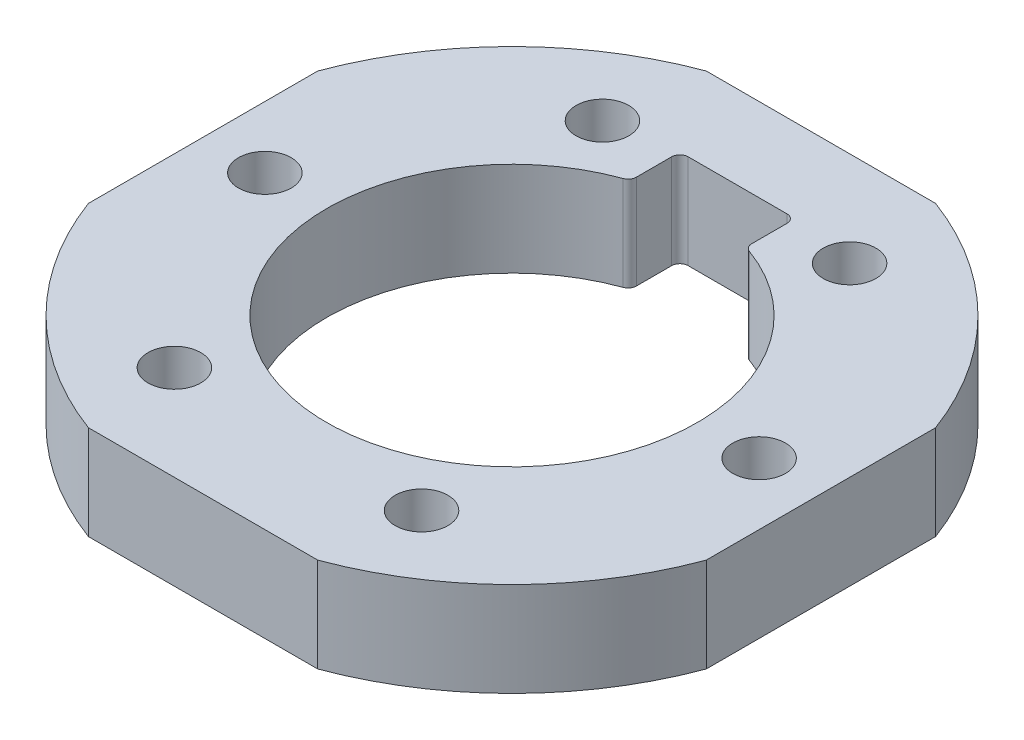
ISO-10303-21;
HEADER;
FILE_DESCRIPTION(('STEP AP214'),'2;1');
FILE_NAME('part.step','',(''),(''),'','','');
FILE_SCHEMA(('AUTOMOTIVE_DESIGN { 1 0 10303 214 1 1 1 1 }'));
ENDSEC;
DATA;
#1=APPLICATION_CONTEXT('core data for automotive mechanical design processes');
#2=APPLICATION_PROTOCOL_DEFINITION('international standard','automotive_design',2000,#1);
#3=PRODUCT_CONTEXT('',#1,'mechanical');
#4=PRODUCT('Part','Part','',(#3));
#5=PRODUCT_RELATED_PRODUCT_CATEGORY('part','',(#4));
#6=PRODUCT_DEFINITION_FORMATION('','',#4);
#7=PRODUCT_DEFINITION_CONTEXT('part definition',#1,'design');
#8=PRODUCT_DEFINITION('design','',#6,#7);
#9=PRODUCT_DEFINITION_SHAPE('','',#8);
#10=(LENGTH_UNIT() NAMED_UNIT(*) SI_UNIT(.MILLI.,.METRE.));
#11=(NAMED_UNIT(*) PLANE_ANGLE_UNIT() SI_UNIT($,.RADIAN.));
#12=(NAMED_UNIT(*) SI_UNIT($,.STERADIAN.) SOLID_ANGLE_UNIT());
#13=UNCERTAINTY_MEASURE_WITH_UNIT(LENGTH_MEASURE(1.E-05),#10,'distance_accuracy_value','');
#14=(GEOMETRIC_REPRESENTATION_CONTEXT(3) GLOBAL_UNCERTAINTY_ASSIGNED_CONTEXT((#13)) GLOBAL_UNIT_ASSIGNED_CONTEXT((#10,
#11,#12)) REPRESENTATION_CONTEXT('',''));
#15=CARTESIAN_POINT('',(0.,0.,0.));
#16=DIRECTION('',(0.,0.,1.));
#17=DIRECTION('',(1.,0.,0.));
#18=AXIS2_PLACEMENT_3D('',#15,#16,#17);
#19=CARTESIAN_POINT('',(0.,-11.45,37.5));
#20=DIRECTION('',(0.,0.,1.));
#21=DIRECTION('',(1.,0.,0.));
#22=AXIS2_PLACEMENT_3D('',#19,#20,#21);
#23=PLANE('',#22);
#24=DIRECTION('',(1.,0.,0.));
#25=VECTOR('',#24,1.);
#26=CARTESIAN_POINT('',(0.,0.,37.5));
#27=LINE('',#26,#25);
#28=CARTESIAN_POINT('',(-13.9194109070751,0.,37.5));
#29=VERTEX_POINT('',#28);
#30=CARTESIAN_POINT('',(13.9194109070751,0.,37.5));
#31=VERTEX_POINT('',#30);
#32=EDGE_CURVE('E204',#29,#31,#27,.T.);
#33=ORIENTED_EDGE('',*,*,#32,.F.);
#34=DIRECTION('',(0.,1.,0.));
#35=VECTOR('',#34,1.);
#36=CARTESIAN_POINT('',(-13.9194109070751,-11.45,37.5));
#37=LINE('',#36,#35);
#38=CARTESIAN_POINT('',(-13.9194109070751,-11.45,37.5));
#39=VERTEX_POINT('',#38);
#40=EDGE_CURVE('E177',#39,#29,#37,.T.);
#41=ORIENTED_EDGE('',*,*,#40,.F.);
#42=DIRECTION('',(1.,0.,0.));
#43=VECTOR('',#42,1.);
#44=CARTESIAN_POINT('',(0.,-11.45,37.5));
#45=LINE('',#44,#43);
#46=CARTESIAN_POINT('',(13.9194109070751,-11.45,37.5));
#47=VERTEX_POINT('',#46);
#48=EDGE_CURVE('E169',#39,#47,#45,.T.);
#49=ORIENTED_EDGE('',*,*,#48,.T.);
#50=DIRECTION('',(0.,1.,0.));
#51=VECTOR('',#50,1.);
#52=CARTESIAN_POINT('',(13.9194109070751,-11.45,37.5));
#53=LINE('',#52,#51);
#54=EDGE_CURVE('E152',#47,#31,#53,.T.);
#55=ORIENTED_EDGE('',*,*,#54,.T.);
#56=EDGE_LOOP('',(#33,#41,#49,#55));
#57=FACE_BOUND('',#56,.T.);
#58=ADVANCED_FACE('F38',(#57),#23,.T.);
#59=CARTESIAN_POINT('',(0.,-11.45,0.));
#60=DIRECTION('',(0.,1.,0.));
#61=DIRECTION('',(0.,0.,1.));
#62=AXIS2_PLACEMENT_3D('',#59,#60,#61);
#63=CYLINDRICAL_SURFACE('',#62,40.);
#64=CARTESIAN_POINT('',(0.,0.,0.));
#65=DIRECTION('',(0.,1.,0.));
#66=DIRECTION('',(0.,0.,1.));
#67=AXIS2_PLACEMENT_3D('',#64,#65,#66);
#68=CIRCLE('',#67,40.);
#69=CARTESIAN_POINT('',(-37.5,0.,13.9194109070751));
#70=VERTEX_POINT('',#69);
#71=EDGE_CURVE('E208',#70,#29,#68,.T.);
#72=ORIENTED_EDGE('',*,*,#71,.F.);
#73=DIRECTION('',(0.,1.,0.));
#74=VECTOR('',#73,1.);
#75=CARTESIAN_POINT('',(-37.5,-11.45,13.9194109070751));
#76=LINE('',#75,#74);
#77=CARTESIAN_POINT('',(-37.5,-11.45,13.9194109070751));
#78=VERTEX_POINT('',#77);
#79=EDGE_CURVE('E221',#78,#70,#76,.T.);
#80=ORIENTED_EDGE('',*,*,#79,.F.);
#81=CARTESIAN_POINT('',(0.,-11.45,0.));
#82=DIRECTION('',(0.,1.,0.));
#83=DIRECTION('',(0.,0.,1.));
#84=AXIS2_PLACEMENT_3D('',#81,#82,#83);
#85=CIRCLE('',#84,40.);
#86=EDGE_CURVE('E163',#78,#39,#85,.T.);
#87=ORIENTED_EDGE('',*,*,#86,.T.);
#88=ORIENTED_EDGE('',*,*,#40,.T.);
#89=EDGE_LOOP('',(#72,#80,#87,#88));
#90=FACE_BOUND('',#89,.T.);
#91=ADVANCED_FACE('F349',(#90),#63,.T.);
#92=CARTESIAN_POINT('',(-37.5,-11.45,0.));
#93=DIRECTION('',(-1.,0.,0.));
#94=DIRECTION('',(0.,0.,1.));
#95=AXIS2_PLACEMENT_3D('',#92,#93,#94);
#96=PLANE('',#95);
#97=DIRECTION('',(0.,0.,1.));
#98=VECTOR('',#97,1.);
#99=CARTESIAN_POINT('',(-37.5,0.,0.));
#100=LINE('',#99,#98);
#101=CARTESIAN_POINT('',(-37.5,0.,-13.9194109070751));
#102=VERTEX_POINT('',#101);
#103=EDGE_CURVE('E216',#102,#70,#100,.T.);
#104=ORIENTED_EDGE('',*,*,#103,.F.);
#105=DIRECTION('',(0.,1.,0.));
#106=VECTOR('',#105,1.);
#107=CARTESIAN_POINT('',(-37.5,-11.45,-13.9194109070751));
#108=LINE('',#107,#106);
#109=CARTESIAN_POINT('',(-37.5,-11.45,-13.9194109070751));
#110=VERTEX_POINT('',#109);
#111=EDGE_CURVE('E223',#110,#102,#108,.T.);
#112=ORIENTED_EDGE('',*,*,#111,.F.);
#113=DIRECTION('',(0.,0.,1.));
#114=VECTOR('',#113,1.);
#115=CARTESIAN_POINT('',(-37.5,-11.45,0.));
#116=LINE('',#115,#114);
#117=EDGE_CURVE('E189',#110,#78,#116,.T.);
#118=ORIENTED_EDGE('',*,*,#117,.T.);
#119=ORIENTED_EDGE('',*,*,#79,.T.);
#120=EDGE_LOOP('',(#104,#112,#118,#119));
#121=FACE_BOUND('',#120,.T.);
#122=ADVANCED_FACE('F354',(#121),#96,.T.);
#123=CARTESIAN_POINT('',(-13.9194109070751,0.,-37.5));
#124=VERTEX_POINT('',#123);
#125=EDGE_CURVE('E215',#124,#102,#68,.T.);
#126=ORIENTED_EDGE('',*,*,#125,.F.);
#127=DIRECTION('',(0.,1.,0.));
#128=VECTOR('',#127,1.);
#129=CARTESIAN_POINT('',(-13.9194109070751,-11.45,-37.5));
#130=LINE('',#129,#128);
#131=CARTESIAN_POINT('',(-13.9194109070751,-11.45,-37.5));
#132=VERTEX_POINT('',#131);
#133=EDGE_CURVE('E225',#132,#124,#130,.T.);
#134=ORIENTED_EDGE('',*,*,#133,.F.);
#135=EDGE_CURVE('E188',#132,#110,#85,.T.);
#136=ORIENTED_EDGE('',*,*,#135,.T.);
#137=ORIENTED_EDGE('',*,*,#111,.T.);
#138=EDGE_LOOP('',(#126,#134,#136,#137));
#139=FACE_BOUND('',#138,.T.);
#140=ADVANCED_FACE('F357',(#139),#63,.T.);
#141=CARTESIAN_POINT('',(0.,-11.45,-37.5));
#142=DIRECTION('',(0.,0.,1.));
#143=DIRECTION('',(1.,0.,0.));
#144=AXIS2_PLACEMENT_3D('',#141,#142,#143);
#145=PLANE('',#144);
#146=DIRECTION('',(1.,0.,0.));
#147=VECTOR('',#146,1.);
#148=CARTESIAN_POINT('',(0.,0.,-37.5));
#149=LINE('',#148,#147);
#150=CARTESIAN_POINT('',(13.9194109070751,0.,-37.5));
#151=VERTEX_POINT('',#150);
#152=EDGE_CURVE('E212',#124,#151,#149,.T.);
#153=ORIENTED_EDGE('',*,*,#152,.T.);
#154=DIRECTION('',(0.,1.,0.));
#155=VECTOR('',#154,1.);
#156=CARTESIAN_POINT('',(13.9194109070751,-11.45,-37.5));
#157=LINE('',#156,#155);
#158=CARTESIAN_POINT('',(13.9194109070751,-11.45,-37.5));
#159=VERTEX_POINT('',#158);
#160=EDGE_CURVE('E227',#159,#151,#157,.T.);
#161=ORIENTED_EDGE('',*,*,#160,.F.);
#162=DIRECTION('',(1.,0.,0.));
#163=VECTOR('',#162,1.);
#164=CARTESIAN_POINT('',(0.,-11.45,-37.5));
#165=LINE('',#164,#163);
#166=EDGE_CURVE('E186',#132,#159,#165,.T.);
#167=ORIENTED_EDGE('',*,*,#166,.F.);
#168=ORIENTED_EDGE('',*,*,#133,.T.);
#169=EDGE_LOOP('',(#153,#161,#167,#168));
#170=FACE_BOUND('',#169,.T.);
#171=ADVANCED_FACE('F522',(#170),#145,.F.);
#172=CARTESIAN_POINT('',(37.5,0.,-13.9194109070751));
#173=VERTEX_POINT('',#172);
#174=EDGE_CURVE('E209',#173,#151,#68,.T.);
#175=ORIENTED_EDGE('',*,*,#174,.F.);
#176=DIRECTION('',(0.,1.,0.));
#177=VECTOR('',#176,1.);
#178=CARTESIAN_POINT('',(37.5,-11.45,-13.9194109070751));
#179=LINE('',#178,#177);
#180=CARTESIAN_POINT('',(37.5,-11.45,-13.9194109070751));
#181=VERTEX_POINT('',#180);
#182=EDGE_CURVE('E229',#181,#173,#179,.T.);
#183=ORIENTED_EDGE('',*,*,#182,.F.);
#184=EDGE_CURVE('E176',#181,#159,#85,.T.);
#185=ORIENTED_EDGE('',*,*,#184,.T.);
#186=ORIENTED_EDGE('',*,*,#160,.T.);
#187=EDGE_LOOP('',(#175,#183,#185,#186));
#188=FACE_BOUND('',#187,.T.);
#189=ADVANCED_FACE('F508',(#188),#63,.T.);
#190=CARTESIAN_POINT('',(37.5,-11.45,0.));
#191=DIRECTION('',(-1.,0.,0.));
#192=DIRECTION('',(0.,0.,1.));
#193=AXIS2_PLACEMENT_3D('',#190,#191,#192);
#194=PLANE('',#193);
#195=DIRECTION('',(0.,0.,1.));
#196=VECTOR('',#195,1.);
#197=CARTESIAN_POINT('',(37.5,0.,0.));
#198=LINE('',#197,#196);
#199=CARTESIAN_POINT('',(37.5,0.,13.9194109070751));
#200=VERTEX_POINT('',#199);
#201=EDGE_CURVE('E207',#173,#200,#198,.T.);
#202=ORIENTED_EDGE('',*,*,#201,.T.);
#203=DIRECTION('',(0.,1.,0.));
#204=VECTOR('',#203,1.);
#205=CARTESIAN_POINT('',(37.5,-11.45,13.9194109070751));
#206=LINE('',#205,#204);
#207=CARTESIAN_POINT('',(37.5,-11.45,13.9194109070751));
#208=VERTEX_POINT('',#207);
#209=EDGE_CURVE('E162',#208,#200,#206,.T.);
#210=ORIENTED_EDGE('',*,*,#209,.F.);
#211=DIRECTION('',(0.,0.,1.));
#212=VECTOR('',#211,1.);
#213=CARTESIAN_POINT('',(37.5,-11.45,0.));
#214=LINE('',#213,#212);
#215=EDGE_CURVE('E173',#181,#208,#214,.T.);
#216=ORIENTED_EDGE('',*,*,#215,.F.);
#217=ORIENTED_EDGE('',*,*,#182,.T.);
#218=EDGE_LOOP('',(#202,#210,#216,#217));
#219=FACE_BOUND('',#218,.T.);
#220=ADVANCED_FACE('F360',(#219),#194,.F.);
#221=CARTESIAN_POINT('',(0.,-11.45,0.));
#222=DIRECTION('',(0.,1.,0.));
#223=DIRECTION('',(0.,0.,1.));
#224=AXIS2_PLACEMENT_3D('',#221,#222,#223);
#225=CYLINDRICAL_SURFACE('',#224,22.5);
#226=CARTESIAN_POINT('',(0.,0.,0.));
#227=DIRECTION('',(0.,1.,0.));
#228=DIRECTION('',(0.,0.,1.));
#229=AXIS2_PLACEMENT_3D('',#226,#227,#228);
#230=CIRCLE('',#229,22.5);
#231=CARTESIAN_POINT('',(-7.65957446808511,0.,-21.1561083133893));
#232=VERTEX_POINT('',#231);
#233=CARTESIAN_POINT('',(7.65957446808511,0.,-21.1561083133893));
#234=VERTEX_POINT('',#233);
#235=EDGE_CURVE('E192',#232,#234,#230,.T.);
#236=ORIENTED_EDGE('',*,*,#235,.T.);
#237=DIRECTION('',(0.,1.,0.));
#238=VECTOR('',#237,1.);
#239=CARTESIAN_POINT('',(7.65957446808511,-11.45,-21.1561083133893));
#240=LINE('',#239,#238);
#241=CARTESIAN_POINT('',(7.65957446808511,-11.45,-21.1561083133893));
#242=VERTEX_POINT('',#241);
#243=EDGE_CURVE('E53',#234,#242,#240,.F.);
#244=ORIENTED_EDGE('',*,*,#243,.T.);
#245=CARTESIAN_POINT('',(0.,-11.45,0.));
#246=DIRECTION('',(0.,1.,0.));
#247=DIRECTION('',(0.,0.,1.));
#248=AXIS2_PLACEMENT_3D('',#245,#246,#247);
#249=CIRCLE('',#248,22.5);
#250=CARTESIAN_POINT('',(-7.65957446808511,-11.45,-21.1561083133893));
#251=VERTEX_POINT('',#250);
#252=EDGE_CURVE('E280',#251,#242,#249,.T.);
#253=ORIENTED_EDGE('',*,*,#252,.F.);
#254=DIRECTION('',(0.,1.,0.));
#255=VECTOR('',#254,1.);
#256=CARTESIAN_POINT('',(-7.65957446808511,-11.45,-21.1561083133893));
#257=LINE('',#256,#255);
#258=EDGE_CURVE('E250',#251,#232,#257,.T.);
#259=ORIENTED_EDGE('',*,*,#258,.T.);
#260=EDGE_LOOP('',(#236,#244,#253,#259));
#261=FACE_BOUND('',#260,.T.);
#262=ADVANCED_FACE('F365',(#261),#225,.F.);
#263=CARTESIAN_POINT('',(7.00000000000001,-11.45,0.));
#264=DIRECTION('',(-1.,0.,0.));
#265=DIRECTION('',(0.,0.,1.));
#266=AXIS2_PLACEMENT_3D('',#263,#264,#265);
#267=PLANE('',#266);
#268=DIRECTION('',(0.,0.,1.));
#269=VECTOR('',#268,1.);
#270=CARTESIAN_POINT('',(7.00000000000001,0.,0.));
#271=LINE('',#270,#269);
#272=CARTESIAN_POINT('',(7.,0.,-26.3834047803431));
#273=VERTEX_POINT('',#272);
#274=CARTESIAN_POINT('',(7.,0.,-22.0963797939844));
#275=VERTEX_POINT('',#274);
#276=EDGE_CURVE('E201',#273,#275,#271,.T.);
#277=ORIENTED_EDGE('',*,*,#276,.F.);
#278=DIRECTION('',(0.,1.,0.));
#279=VECTOR('',#278,1.);
#280=CARTESIAN_POINT('',(7.,-11.45,-26.3834047803431));
#281=LINE('',#280,#279);
#282=CARTESIAN_POINT('',(7.,-11.45,-26.3834047803431));
#283=VERTEX_POINT('',#282);
#284=EDGE_CURVE('E239',#273,#283,#281,.F.);
#285=ORIENTED_EDGE('',*,*,#284,.T.);
#286=DIRECTION('',(0.,0.,1.));
#287=VECTOR('',#286,1.);
#288=CARTESIAN_POINT('',(7.00000000000001,-11.45,0.));
#289=LINE('',#288,#287);
#290=CARTESIAN_POINT('',(7.,-11.45,-22.0963797939844));
#291=VERTEX_POINT('',#290);
#292=EDGE_CURVE('E178',#283,#291,#289,.T.);
#293=ORIENTED_EDGE('',*,*,#292,.T.);
#294=DIRECTION('',(0.,-1.,0.));
#295=VECTOR('',#294,1.);
#296=CARTESIAN_POINT('',(7.,0.,-22.0963797939844));
#297=LINE('',#296,#295);
#298=EDGE_CURVE('E236',#291,#275,#297,.F.);
#299=ORIENTED_EDGE('',*,*,#298,.T.);
#300=EDGE_LOOP('',(#277,#285,#293,#299));
#301=FACE_BOUND('',#300,.T.);
#302=ADVANCED_FACE('F362',(#301),#267,.T.);
#303=CARTESIAN_POINT('',(0.,-11.45,-27.3834047803431));
#304=DIRECTION('',(0.,0.,1.));
#305=DIRECTION('',(1.,0.,0.));
#306=AXIS2_PLACEMENT_3D('',#303,#304,#305);
#307=PLANE('',#306);
#308=DIRECTION('',(1.,0.,0.));
#309=VECTOR('',#308,1.);
#310=CARTESIAN_POINT('',(0.,-11.45,-27.3834047803431));
#311=LINE('',#310,#309);
#312=CARTESIAN_POINT('',(-6.,-11.45,-27.3834047803431));
#313=VERTEX_POINT('',#312);
#314=CARTESIAN_POINT('',(6.,-11.45,-27.3834047803431));
#315=VERTEX_POINT('',#314);
#316=EDGE_CURVE('E181',#313,#315,#311,.T.);
#317=ORIENTED_EDGE('',*,*,#316,.T.);
#318=DIRECTION('',(0.,1.,0.));
#319=VECTOR('',#318,1.);
#320=CARTESIAN_POINT('',(6.,0.,-27.3834047803431));
#321=LINE('',#320,#319);
#322=CARTESIAN_POINT('',(6.,0.,-27.3834047803431));
#323=VERTEX_POINT('',#322);
#324=EDGE_CURVE('E233',#315,#323,#321,.T.);
#325=ORIENTED_EDGE('',*,*,#324,.T.);
#326=DIRECTION('',(1.,0.,0.));
#327=VECTOR('',#326,1.);
#328=CARTESIAN_POINT('',(0.,0.,-27.3834047803431));
#329=LINE('',#328,#327);
#330=CARTESIAN_POINT('',(-6.,0.,-27.3834047803431));
#331=VERTEX_POINT('',#330);
#332=EDGE_CURVE('E198',#331,#323,#329,.T.);
#333=ORIENTED_EDGE('',*,*,#332,.F.);
#334=DIRECTION('',(0.,1.,0.));
#335=VECTOR('',#334,1.);
#336=CARTESIAN_POINT('',(-6.,-11.45,-27.3834047803431));
#337=LINE('',#336,#335);
#338=EDGE_CURVE('E220',#331,#313,#337,.F.);
#339=ORIENTED_EDGE('',*,*,#338,.T.);
#340=EDGE_LOOP('',(#317,#325,#333,#339));
#341=FACE_BOUND('',#340,.T.);
#342=ADVANCED_FACE('F270',(#341),#307,.T.);
#343=CARTESIAN_POINT('',(-7.,-11.45,0.));
#344=DIRECTION('',(1.,0.,0.));
#345=DIRECTION('',(0.,0.,-1.));
#346=AXIS2_PLACEMENT_3D('',#343,#344,#345);
#347=PLANE('',#346);
#348=DIRECTION('',(0.,0.,-1.));
#349=VECTOR('',#348,1.);
#350=CARTESIAN_POINT('',(-7.,-11.45,0.));
#351=LINE('',#350,#349);
#352=CARTESIAN_POINT('',(-7.,-11.45,-22.0963797939844));
#353=VERTEX_POINT('',#352);
#354=CARTESIAN_POINT('',(-7.,-11.45,-26.3834047803431));
#355=VERTEX_POINT('',#354);
#356=EDGE_CURVE('E276',#353,#355,#351,.T.);
#357=ORIENTED_EDGE('',*,*,#356,.T.);
#358=DIRECTION('',(0.,1.,0.));
#359=VECTOR('',#358,1.);
#360=CARTESIAN_POINT('',(-7.,0.,-26.3834047803431));
#361=LINE('',#360,#359);
#362=CARTESIAN_POINT('',(-7.,0.,-26.3834047803431));
#363=VERTEX_POINT('',#362);
#364=EDGE_CURVE('E243',#355,#363,#361,.T.);
#365=ORIENTED_EDGE('',*,*,#364,.T.);
#366=DIRECTION('',(0.,0.,-1.));
#367=VECTOR('',#366,1.);
#368=CARTESIAN_POINT('',(-7.,0.,0.));
#369=LINE('',#368,#367);
#370=CARTESIAN_POINT('',(-7.,0.,-22.0963797939844));
#371=VERTEX_POINT('',#370);
#372=EDGE_CURVE('E194',#371,#363,#369,.T.);
#373=ORIENTED_EDGE('',*,*,#372,.F.);
#374=DIRECTION('',(0.,-1.,0.));
#375=VECTOR('',#374,1.);
#376=CARTESIAN_POINT('',(-7.,-11.45,-22.0963797939844));
#377=LINE('',#376,#375);
#378=EDGE_CURVE('E241',#371,#353,#377,.T.);
#379=ORIENTED_EDGE('',*,*,#378,.T.);
#380=EDGE_LOOP('',(#357,#365,#373,#379));
#381=FACE_BOUND('',#380,.T.);
#382=ADVANCED_FACE('F278',(#381),#347,.T.);
#383=EDGE_CURVE('E157',#31,#200,#68,.T.);
#384=ORIENTED_EDGE('',*,*,#383,.F.);
#385=ORIENTED_EDGE('',*,*,#54,.F.);
#386=EDGE_CURVE('E155',#47,#208,#85,.T.);
#387=ORIENTED_EDGE('',*,*,#386,.T.);
#388=ORIENTED_EDGE('',*,*,#209,.T.);
#389=EDGE_LOOP('',(#384,#385,#387,#388));
#390=FACE_BOUND('',#389,.T.);
#391=ADVANCED_FACE('F154',(#390),#63,.T.);
#392=CARTESIAN_POINT('',(0.,-11.45,0.));
#393=DIRECTION('',(0.,1.,0.));
#394=DIRECTION('',(0.,0.,1.));
#395=AXIS2_PLACEMENT_3D('',#392,#393,#394);
#396=PLANE('',#395);
#397=CARTESIAN_POINT('',(-30.,-11.45,0.));
#398=DIRECTION('',(0.,1.,0.));
#399=DIRECTION('',(0.,0.,1.));
#400=AXIS2_PLACEMENT_3D('',#397,#398,#399);
#401=CIRCLE('',#400,3.2);
#402=CARTESIAN_POINT('',(-30.,-11.45,3.2));
#403=VERTEX_POINT('',#402);
#404=EDGE_CURVE('E313',#403,#403,#401,.T.);
#405=ORIENTED_EDGE('',*,*,#404,.T.);
#406=EDGE_LOOP('',(#405));
#407=FACE_BOUND('',#406,.T.);
#408=CARTESIAN_POINT('',(-15.,-11.45,-25.9807621135331));
#409=DIRECTION('',(0.,1.,0.));
#410=DIRECTION('',(0.,0.,1.));
#411=AXIS2_PLACEMENT_3D('',#408,#409,#410);
#412=CIRCLE('',#411,3.2);
#413=CARTESIAN_POINT('',(-15.,-11.45,-22.7807621135332));
#414=VERTEX_POINT('',#413);
#415=EDGE_CURVE('E307',#414,#414,#412,.T.);
#416=ORIENTED_EDGE('',*,*,#415,.T.);
#417=EDGE_LOOP('',(#416));
#418=FACE_BOUND('',#417,.T.);
#419=CARTESIAN_POINT('',(15.,-11.45,-25.9807621135332));
#420=DIRECTION('',(0.,1.,0.));
#421=DIRECTION('',(0.,0.,1.));
#422=AXIS2_PLACEMENT_3D('',#419,#420,#421);
#423=CIRCLE('',#422,3.2);
#424=CARTESIAN_POINT('',(15.,-11.45,-22.7807621135332));
#425=VERTEX_POINT('',#424);
#426=EDGE_CURVE('E301',#425,#425,#423,.T.);
#427=ORIENTED_EDGE('',*,*,#426,.T.);
#428=EDGE_LOOP('',(#427));
#429=FACE_BOUND('',#428,.T.);
#430=CARTESIAN_POINT('',(30.,-11.45,0.));
#431=DIRECTION('',(0.,1.,0.));
#432=DIRECTION('',(0.,0.,1.));
#433=AXIS2_PLACEMENT_3D('',#430,#431,#432);
#434=CIRCLE('',#433,3.2);
#435=CARTESIAN_POINT('',(30.,-11.45,3.19999999999999));
#436=VERTEX_POINT('',#435);
#437=EDGE_CURVE('E295',#436,#436,#434,.T.);
#438=ORIENTED_EDGE('',*,*,#437,.T.);
#439=EDGE_LOOP('',(#438));
#440=FACE_BOUND('',#439,.T.);
#441=CARTESIAN_POINT('',(15.,-11.45,25.9807621135331));
#442=DIRECTION('',(0.,1.,0.));
#443=DIRECTION('',(0.,0.,1.));
#444=AXIS2_PLACEMENT_3D('',#441,#442,#443);
#445=CIRCLE('',#444,3.2);
#446=CARTESIAN_POINT('',(15.,-11.45,29.1807621135331));
#447=VERTEX_POINT('',#446);
#448=EDGE_CURVE('E289',#447,#447,#445,.T.);
#449=ORIENTED_EDGE('',*,*,#448,.T.);
#450=EDGE_LOOP('',(#449));
#451=FACE_BOUND('',#450,.T.);
#452=CARTESIAN_POINT('',(-15.,-11.45,25.9807621135332));
#453=DIRECTION('',(0.,1.,0.));
#454=DIRECTION('',(0.,0.,1.));
#455=AXIS2_PLACEMENT_3D('',#452,#453,#454);
#456=CIRCLE('',#455,3.2);
#457=CARTESIAN_POINT('',(-15.,-11.45,29.1807621135332));
#458=VERTEX_POINT('',#457);
#459=EDGE_CURVE('E195',#458,#458,#456,.T.);
#460=ORIENTED_EDGE('',*,*,#459,.T.);
#461=EDGE_LOOP('',(#460));
#462=FACE_BOUND('',#461,.T.);
#463=ORIENTED_EDGE('',*,*,#252,.T.);
#464=CARTESIAN_POINT('',(8.,-11.45,-22.0963797939844));
#465=DIRECTION('',(0.,1.,0.));
#466=DIRECTION('',(0.,0.,1.));
#467=AXIS2_PLACEMENT_3D('',#464,#465,#466);
#468=CIRCLE('',#467,1.);
#469=EDGE_CURVE('E255',#242,#291,#468,.F.);
#470=ORIENTED_EDGE('',*,*,#469,.T.);
#471=ORIENTED_EDGE('',*,*,#292,.F.);
#472=CARTESIAN_POINT('',(6.,-11.45,-26.3834047803431));
#473=DIRECTION('',(0.,1.,0.));
#474=DIRECTION('',(0.,0.,1.));
#475=AXIS2_PLACEMENT_3D('',#472,#473,#474);
#476=CIRCLE('',#475,1.);
#477=EDGE_CURVE('E259',#283,#315,#476,.T.);
#478=ORIENTED_EDGE('',*,*,#477,.T.);
#479=ORIENTED_EDGE('',*,*,#316,.F.);
#480=CARTESIAN_POINT('',(-6.,-11.45,-26.3834047803431));
#481=DIRECTION('',(0.,1.,0.));
#482=DIRECTION('',(0.,0.,1.));
#483=AXIS2_PLACEMENT_3D('',#480,#481,#482);
#484=CIRCLE('',#483,1.);
#485=EDGE_CURVE('E11',#313,#355,#484,.T.);
#486=ORIENTED_EDGE('',*,*,#485,.T.);
#487=ORIENTED_EDGE('',*,*,#356,.F.);
#488=CARTESIAN_POINT('',(-8.,-11.45,-22.0963797939844));
#489=DIRECTION('',(0.,1.,0.));
#490=DIRECTION('',(0.,0.,1.));
#491=AXIS2_PLACEMENT_3D('',#488,#489,#490);
#492=CIRCLE('',#491,1.);
#493=EDGE_CURVE('E60',#353,#251,#492,.F.);
#494=ORIENTED_EDGE('',*,*,#493,.T.);
#495=EDGE_LOOP('',(#463,#470,#471,#478,#479,#486,#487,#494));
#496=FACE_BOUND('',#495,.T.);
#497=ORIENTED_EDGE('',*,*,#48,.F.);
#498=ORIENTED_EDGE('',*,*,#86,.F.);
#499=ORIENTED_EDGE('',*,*,#117,.F.);
#500=ORIENTED_EDGE('',*,*,#135,.F.);
#501=ORIENTED_EDGE('',*,*,#166,.T.);
#502=ORIENTED_EDGE('',*,*,#184,.F.);
#503=ORIENTED_EDGE('',*,*,#215,.T.);
#504=ORIENTED_EDGE('',*,*,#386,.F.);
#505=EDGE_LOOP('',(#497,#498,#499,#500,#501,#502,#503,#504));
#506=FACE_BOUND('',#505,.T.);
#507=ADVANCED_FACE('F167',(#407,#418,#429,#440,#451,#462,#496,#506),#396,.F.);
#508=CARTESIAN_POINT('',(0.,0.,0.));
#509=DIRECTION('',(0.,1.,0.));
#510=DIRECTION('',(0.,0.,1.));
#511=AXIS2_PLACEMENT_3D('',#508,#509,#510);
#512=PLANE('',#511);
#513=CARTESIAN_POINT('',(-30.,0.,0.));
#514=DIRECTION('',(0.,1.,0.));
#515=DIRECTION('',(0.,0.,1.));
#516=AXIS2_PLACEMENT_3D('',#513,#514,#515);
#517=CIRCLE('',#516,3.2);
#518=CARTESIAN_POINT('',(-30.,0.,3.2));
#519=VERTEX_POINT('',#518);
#520=EDGE_CURVE('E316',#519,#519,#517,.T.);
#521=ORIENTED_EDGE('',*,*,#520,.F.);
#522=EDGE_LOOP('',(#521));
#523=FACE_BOUND('',#522,.T.);
#524=CARTESIAN_POINT('',(-15.,0.,-25.9807621135331));
#525=DIRECTION('',(0.,1.,0.));
#526=DIRECTION('',(0.,0.,1.));
#527=AXIS2_PLACEMENT_3D('',#524,#525,#526);
#528=CIRCLE('',#527,3.2);
#529=CARTESIAN_POINT('',(-15.,0.,-22.7807621135332));
#530=VERTEX_POINT('',#529);
#531=EDGE_CURVE('E310',#530,#530,#528,.T.);
#532=ORIENTED_EDGE('',*,*,#531,.F.);
#533=EDGE_LOOP('',(#532));
#534=FACE_BOUND('',#533,.T.);
#535=CARTESIAN_POINT('',(15.,0.,-25.9807621135332));
#536=DIRECTION('',(0.,1.,0.));
#537=DIRECTION('',(0.,0.,1.));
#538=AXIS2_PLACEMENT_3D('',#535,#536,#537);
#539=CIRCLE('',#538,3.2);
#540=CARTESIAN_POINT('',(15.,0.,-22.7807621135332));
#541=VERTEX_POINT('',#540);
#542=EDGE_CURVE('E304',#541,#541,#539,.T.);
#543=ORIENTED_EDGE('',*,*,#542,.F.);
#544=EDGE_LOOP('',(#543));
#545=FACE_BOUND('',#544,.T.);
#546=CARTESIAN_POINT('',(30.,0.,0.));
#547=DIRECTION('',(0.,1.,0.));
#548=DIRECTION('',(0.,0.,1.));
#549=AXIS2_PLACEMENT_3D('',#546,#547,#548);
#550=CIRCLE('',#549,3.2);
#551=CARTESIAN_POINT('',(30.,0.,3.19999999999999));
#552=VERTEX_POINT('',#551);
#553=EDGE_CURVE('E298',#552,#552,#550,.T.);
#554=ORIENTED_EDGE('',*,*,#553,.F.);
#555=EDGE_LOOP('',(#554));
#556=FACE_BOUND('',#555,.T.);
#557=CARTESIAN_POINT('',(15.,0.,25.9807621135331));
#558=DIRECTION('',(0.,1.,0.));
#559=DIRECTION('',(0.,0.,1.));
#560=AXIS2_PLACEMENT_3D('',#557,#558,#559);
#561=CIRCLE('',#560,3.2);
#562=CARTESIAN_POINT('',(15.,0.,29.1807621135331));
#563=VERTEX_POINT('',#562);
#564=EDGE_CURVE('E292',#563,#563,#561,.T.);
#565=ORIENTED_EDGE('',*,*,#564,.F.);
#566=EDGE_LOOP('',(#565));
#567=FACE_BOUND('',#566,.T.);
#568=CARTESIAN_POINT('',(-15.,0.,25.9807621135332));
#569=DIRECTION('',(0.,1.,0.));
#570=DIRECTION('',(0.,0.,1.));
#571=AXIS2_PLACEMENT_3D('',#568,#569,#570);
#572=CIRCLE('',#571,3.2);
#573=CARTESIAN_POINT('',(-15.,0.,29.1807621135332));
#574=VERTEX_POINT('',#573);
#575=EDGE_CURVE('E286',#574,#574,#572,.T.);
#576=ORIENTED_EDGE('',*,*,#575,.F.);
#577=EDGE_LOOP('',(#576));
#578=FACE_BOUND('',#577,.T.);
#579=ORIENTED_EDGE('',*,*,#276,.T.);
#580=CARTESIAN_POINT('',(8.,0.,-22.0963797939844));
#581=DIRECTION('',(0.,1.,0.));
#582=DIRECTION('',(0.,0.,1.));
#583=AXIS2_PLACEMENT_3D('',#580,#581,#582);
#584=CIRCLE('',#583,1.);
#585=EDGE_CURVE('E248',#275,#234,#584,.T.);
#586=ORIENTED_EDGE('',*,*,#585,.T.);
#587=ORIENTED_EDGE('',*,*,#235,.F.);
#588=CARTESIAN_POINT('',(-8.,0.,-22.0963797939844));
#589=DIRECTION('',(0.,1.,0.));
#590=DIRECTION('',(0.,0.,1.));
#591=AXIS2_PLACEMENT_3D('',#588,#589,#590);
#592=CIRCLE('',#591,1.);
#593=EDGE_CURVE('E246',#232,#371,#592,.T.);
#594=ORIENTED_EDGE('',*,*,#593,.T.);
#595=ORIENTED_EDGE('',*,*,#372,.T.);
#596=CARTESIAN_POINT('',(-6.,0.,-26.3834047803431));
#597=DIRECTION('',(0.,1.,0.));
#598=DIRECTION('',(0.,0.,1.));
#599=AXIS2_PLACEMENT_3D('',#596,#597,#598);
#600=CIRCLE('',#599,1.);
#601=EDGE_CURVE('E46',#363,#331,#600,.F.);
#602=ORIENTED_EDGE('',*,*,#601,.T.);
#603=ORIENTED_EDGE('',*,*,#332,.T.);
#604=CARTESIAN_POINT('',(6.,0.,-26.3834047803431));
#605=DIRECTION('',(0.,1.,0.));
#606=DIRECTION('',(0.,0.,1.));
#607=AXIS2_PLACEMENT_3D('',#604,#605,#606);
#608=CIRCLE('',#607,1.);
#609=EDGE_CURVE('E257',#323,#273,#608,.F.);
#610=ORIENTED_EDGE('',*,*,#609,.T.);
#611=EDGE_LOOP('',(#579,#586,#587,#594,#595,#602,#603,#610));
#612=FACE_BOUND('',#611,.T.);
#613=ORIENTED_EDGE('',*,*,#32,.T.);
#614=ORIENTED_EDGE('',*,*,#383,.T.);
#615=ORIENTED_EDGE('',*,*,#201,.F.);
#616=ORIENTED_EDGE('',*,*,#174,.T.);
#617=ORIENTED_EDGE('',*,*,#152,.F.);
#618=ORIENTED_EDGE('',*,*,#125,.T.);
#619=ORIENTED_EDGE('',*,*,#103,.T.);
#620=ORIENTED_EDGE('',*,*,#71,.T.);
#621=EDGE_LOOP('',(#613,#614,#615,#616,#617,#618,#619,#620));
#622=FACE_BOUND('',#621,.T.);
#623=ADVANCED_FACE('F262',(#523,#534,#545,#556,#567,#578,#612,#622),#512,.T.);
#624=CARTESIAN_POINT('',(-15.,0.,25.9807621135332));
#625=DIRECTION('',(0.,1.,0.));
#626=DIRECTION('',(0.,0.,1.));
#627=AXIS2_PLACEMENT_3D('',#624,#625,#626);
#628=CYLINDRICAL_SURFACE('',#627,3.2);
#629=ORIENTED_EDGE('',*,*,#459,.F.);
#630=EDGE_LOOP('',(#629));
#631=FACE_BOUND('',#630,.T.);
#632=ORIENTED_EDGE('',*,*,#575,.T.);
#633=EDGE_LOOP('',(#632));
#634=FACE_BOUND('',#633,.T.);
#635=ADVANCED_FACE('F324',(#631,#634),#628,.F.);
#636=CARTESIAN_POINT('',(15.,0.,25.9807621135331));
#637=DIRECTION('',(0.,1.,0.));
#638=DIRECTION('',(0.,0.,1.));
#639=AXIS2_PLACEMENT_3D('',#636,#637,#638);
#640=CYLINDRICAL_SURFACE('',#639,3.2);
#641=ORIENTED_EDGE('',*,*,#448,.F.);
#642=EDGE_LOOP('',(#641));
#643=FACE_BOUND('',#642,.T.);
#644=ORIENTED_EDGE('',*,*,#564,.T.);
#645=EDGE_LOOP('',(#644));
#646=FACE_BOUND('',#645,.T.);
#647=ADVANCED_FACE('F337',(#643,#646),#640,.F.);
#648=CARTESIAN_POINT('',(30.,0.,0.));
#649=DIRECTION('',(0.,1.,0.));
#650=DIRECTION('',(0.,0.,1.));
#651=AXIS2_PLACEMENT_3D('',#648,#649,#650);
#652=CYLINDRICAL_SURFACE('',#651,3.2);
#653=ORIENTED_EDGE('',*,*,#437,.F.);
#654=EDGE_LOOP('',(#653));
#655=FACE_BOUND('',#654,.T.);
#656=ORIENTED_EDGE('',*,*,#553,.T.);
#657=EDGE_LOOP('',(#656));
#658=FACE_BOUND('',#657,.T.);
#659=ADVANCED_FACE('F343',(#655,#658),#652,.F.);
#660=CARTESIAN_POINT('',(15.,0.,-25.9807621135332));
#661=DIRECTION('',(0.,1.,0.));
#662=DIRECTION('',(0.,0.,1.));
#663=AXIS2_PLACEMENT_3D('',#660,#661,#662);
#664=CYLINDRICAL_SURFACE('',#663,3.2);
#665=ORIENTED_EDGE('',*,*,#426,.F.);
#666=EDGE_LOOP('',(#665));
#667=FACE_BOUND('',#666,.T.);
#668=ORIENTED_EDGE('',*,*,#542,.T.);
#669=EDGE_LOOP('',(#668));
#670=FACE_BOUND('',#669,.T.);
#671=ADVANCED_FACE('F473',(#667,#670),#664,.F.);
#672=CARTESIAN_POINT('',(-15.,0.,-25.9807621135331));
#673=DIRECTION('',(0.,1.,0.));
#674=DIRECTION('',(0.,0.,1.));
#675=AXIS2_PLACEMENT_3D('',#672,#673,#674);
#676=CYLINDRICAL_SURFACE('',#675,3.2);
#677=ORIENTED_EDGE('',*,*,#415,.F.);
#678=EDGE_LOOP('',(#677));
#679=FACE_BOUND('',#678,.T.);
#680=ORIENTED_EDGE('',*,*,#531,.T.);
#681=EDGE_LOOP('',(#680));
#682=FACE_BOUND('',#681,.T.);
#683=ADVANCED_FACE('F463',(#679,#682),#676,.F.);
#684=CARTESIAN_POINT('',(-30.,0.,0.));
#685=DIRECTION('',(0.,1.,0.));
#686=DIRECTION('',(0.,0.,1.));
#687=AXIS2_PLACEMENT_3D('',#684,#685,#686);
#688=CYLINDRICAL_SURFACE('',#687,3.2);
#689=ORIENTED_EDGE('',*,*,#404,.F.);
#690=EDGE_LOOP('',(#689));
#691=FACE_BOUND('',#690,.T.);
#692=ORIENTED_EDGE('',*,*,#520,.T.);
#693=EDGE_LOOP('',(#692));
#694=FACE_BOUND('',#693,.T.);
#695=ADVANCED_FACE('F320',(#691,#694),#688,.F.);
#696=CARTESIAN_POINT('',(6.,-11.45,-26.3834047803431));
#697=DIRECTION('',(0.,-1.,0.));
#698=DIRECTION('',(0.,0.,-1.));
#699=AXIS2_PLACEMENT_3D('',#696,#697,#698);
#700=CYLINDRICAL_SURFACE('',#699,1.);
#701=ORIENTED_EDGE('',*,*,#477,.F.);
#702=ORIENTED_EDGE('',*,*,#284,.F.);
#703=ORIENTED_EDGE('',*,*,#609,.F.);
#704=ORIENTED_EDGE('',*,*,#324,.F.);
#705=EDGE_LOOP('',(#701,#702,#703,#704));
#706=FACE_BOUND('',#705,.T.);
#707=ADVANCED_FACE('F373',(#706),#700,.F.);
#708=CARTESIAN_POINT('',(-6.,-11.45,-26.3834047803431));
#709=DIRECTION('',(0.,-1.,0.));
#710=DIRECTION('',(0.,0.,-1.));
#711=AXIS2_PLACEMENT_3D('',#708,#709,#710);
#712=CYLINDRICAL_SURFACE('',#711,1.);
#713=ORIENTED_EDGE('',*,*,#485,.F.);
#714=ORIENTED_EDGE('',*,*,#338,.F.);
#715=ORIENTED_EDGE('',*,*,#601,.F.);
#716=ORIENTED_EDGE('',*,*,#364,.F.);
#717=EDGE_LOOP('',(#713,#714,#715,#716));
#718=FACE_BOUND('',#717,.T.);
#719=ADVANCED_FACE('F274',(#718),#712,.F.);
#720=CARTESIAN_POINT('',(8.,-11.45,-22.0963797939844));
#721=DIRECTION('',(0.,1.,0.));
#722=DIRECTION('',(0.,0.,1.));
#723=AXIS2_PLACEMENT_3D('',#720,#721,#722);
#724=CYLINDRICAL_SURFACE('',#723,1.);
#725=ORIENTED_EDGE('',*,*,#469,.F.);
#726=ORIENTED_EDGE('',*,*,#243,.F.);
#727=ORIENTED_EDGE('',*,*,#585,.F.);
#728=ORIENTED_EDGE('',*,*,#298,.F.);
#729=EDGE_LOOP('',(#725,#726,#727,#728));
#730=FACE_BOUND('',#729,.T.);
#731=ADVANCED_FACE('F378',(#730),#724,.T.);
#732=CARTESIAN_POINT('',(-8.,-11.45,-22.0963797939844));
#733=DIRECTION('',(0.,1.,0.));
#734=DIRECTION('',(0.,0.,1.));
#735=AXIS2_PLACEMENT_3D('',#732,#733,#734);
#736=CYLINDRICAL_SURFACE('',#735,1.);
#737=ORIENTED_EDGE('',*,*,#493,.F.);
#738=ORIENTED_EDGE('',*,*,#378,.F.);
#739=ORIENTED_EDGE('',*,*,#593,.F.);
#740=ORIENTED_EDGE('',*,*,#258,.F.);
#741=EDGE_LOOP('',(#737,#738,#739,#740));
#742=FACE_BOUND('',#741,.T.);
#743=ADVANCED_FACE('F40',(#742),#736,.T.);
#744=CLOSED_SHELL('',(#58,#91,#122,#140,#171,#189,#220,#262,#302,#342,#382,#391,#507,#623,#635,
#647,#659,#671,#683,#695,#707,#719,#731,#743));
#745=MANIFOLD_SOLID_BREP('B2',#744);
#746=ADVANCED_BREP_SHAPE_REPRESENTATION('',(#18,#745),#14);
#747=SHAPE_DEFINITION_REPRESENTATION(#9,#746);
ENDSEC;
END-ISO-10303-21;
